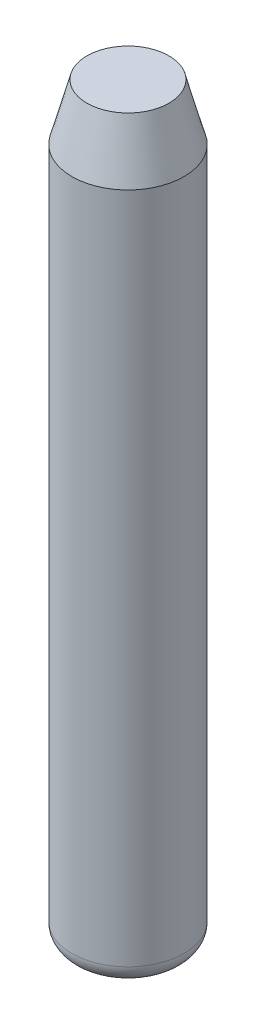
ISO-10303-21;
HEADER;
FILE_DESCRIPTION(('STEP AP214'),'2;1');
FILE_NAME('part.step','',(''),(''),'','','');
FILE_SCHEMA(('AUTOMOTIVE_DESIGN { 1 0 10303 214 1 1 1 1 }'));
ENDSEC;
DATA;
#1=APPLICATION_CONTEXT('core data for automotive mechanical design processes');
#2=APPLICATION_PROTOCOL_DEFINITION('international standard','automotive_design',2000,#1);
#3=PRODUCT_CONTEXT('',#1,'mechanical');
#4=PRODUCT('Part','Part','',(#3));
#5=PRODUCT_RELATED_PRODUCT_CATEGORY('part','',(#4));
#6=PRODUCT_DEFINITION_FORMATION('','',#4);
#7=PRODUCT_DEFINITION_CONTEXT('part definition',#1,'design');
#8=PRODUCT_DEFINITION('design','',#6,#7);
#9=PRODUCT_DEFINITION_SHAPE('','',#8);
#10=(LENGTH_UNIT() NAMED_UNIT(*) SI_UNIT(.MILLI.,.METRE.));
#11=(NAMED_UNIT(*) PLANE_ANGLE_UNIT() SI_UNIT($,.RADIAN.));
#12=(NAMED_UNIT(*) SI_UNIT($,.STERADIAN.) SOLID_ANGLE_UNIT());
#13=UNCERTAINTY_MEASURE_WITH_UNIT(LENGTH_MEASURE(1.E-05),#10,'distance_accuracy_value','');
#14=(GEOMETRIC_REPRESENTATION_CONTEXT(3) GLOBAL_UNCERTAINTY_ASSIGNED_CONTEXT((#13)) GLOBAL_UNIT_ASSIGNED_CONTEXT((#10,
#11,#12)) REPRESENTATION_CONTEXT('',''));
#15=CARTESIAN_POINT('',(0.,0.,0.));
#16=DIRECTION('',(0.,0.,1.));
#17=DIRECTION('',(1.,0.,0.));
#18=AXIS2_PLACEMENT_3D('',#15,#16,#17);
#19=CARTESIAN_POINT('',(0.,20.,0.));
#20=DIRECTION('',(0.,-1.,0.));
#21=DIRECTION('',(0.,0.,-1.));
#22=AXIS2_PLACEMENT_3D('',#19,#20,#21);
#23=CYLINDRICAL_SURFACE('',#22,1.5);
#24=CARTESIAN_POINT('',(0.,0.5,0.));
#25=DIRECTION('',(0.,1.,0.));
#26=DIRECTION('',(0.,0.,1.));
#27=AXIS2_PLACEMENT_3D('',#24,#25,#26);
#28=CIRCLE('',#27,1.5);
#29=CARTESIAN_POINT('',(0.,0.5,1.5));
#30=VERTEX_POINT('',#29);
#31=EDGE_CURVE('E38',#30,#30,#28,.T.);
#32=ORIENTED_EDGE('',*,*,#31,.T.);
#33=EDGE_LOOP('',(#32));
#34=FACE_BOUND('',#33,.T.);
#35=CARTESIAN_POINT('',(0.,18.5,0.));
#36=DIRECTION('',(0.,1.,0.));
#37=DIRECTION('',(0.,0.,1.));
#38=AXIS2_PLACEMENT_3D('',#35,#36,#37);
#39=CIRCLE('',#38,1.5);
#40=CARTESIAN_POINT('',(0.,18.5,1.5));
#41=VERTEX_POINT('',#40);
#42=EDGE_CURVE('E42',#41,#41,#39,.F.);
#43=ORIENTED_EDGE('',*,*,#42,.T.);
#44=EDGE_LOOP('',(#43));
#45=FACE_BOUND('',#44,.T.);
#46=ADVANCED_FACE('F31',(#34,#45),#23,.T.);
#47=CARTESIAN_POINT('',(0.,20.,0.));
#48=DIRECTION('',(0.,1.,0.));
#49=DIRECTION('',(0.,0.,1.));
#50=AXIS2_PLACEMENT_3D('',#47,#48,#49);
#51=PLANE('',#50);
#52=CARTESIAN_POINT('',(0.,20.,0.));
#53=DIRECTION('',(0.,1.,0.));
#54=DIRECTION('',(0.,0.,1.));
#55=AXIS2_PLACEMENT_3D('',#52,#53,#54);
#56=CIRCLE('',#55,1.09807621135331);
#57=CARTESIAN_POINT('',(0.,20.,1.09807621135331));
#58=VERTEX_POINT('',#57);
#59=EDGE_CURVE('E46',#58,#58,#56,.T.);
#60=ORIENTED_EDGE('',*,*,#59,.T.);
#61=EDGE_LOOP('',(#60));
#62=FACE_BOUND('',#61,.T.);
#63=ADVANCED_FACE('F52',(#62),#51,.T.);
#64=CARTESIAN_POINT('',(0.,0.,0.));
#65=DIRECTION('',(0.,1.,0.));
#66=DIRECTION('',(0.,0.,1.));
#67=AXIS2_PLACEMENT_3D('',#64,#65,#66);
#68=PLANE('',#67);
#69=CARTESIAN_POINT('',(0.,0.,0.));
#70=DIRECTION('',(0.,1.,0.));
#71=DIRECTION('',(0.,0.,1.));
#72=AXIS2_PLACEMENT_3D('',#69,#70,#71);
#73=CIRCLE('',#72,1.);
#74=CARTESIAN_POINT('',(0.,0.,1.));
#75=VERTEX_POINT('',#74);
#76=EDGE_CURVE('E10',#75,#75,#73,.F.);
#77=ORIENTED_EDGE('',*,*,#76,.T.);
#78=EDGE_LOOP('',(#77));
#79=FACE_BOUND('',#78,.T.);
#80=ADVANCED_FACE('F56',(#79),#68,.F.);
#81=CARTESIAN_POINT('',(0.,20.,0.));
#82=DIRECTION('',(0.,-1.,0.));
#83=DIRECTION('',(0.,0.,-1.));
#84=AXIS2_PLACEMENT_3D('',#81,#82,#83);
#85=CONICAL_SURFACE('',#84,1.09807621135331,0.261799387799147);
#86=ORIENTED_EDGE('',*,*,#42,.F.);
#87=EDGE_LOOP('',(#86));
#88=FACE_BOUND('',#87,.T.);
#89=ORIENTED_EDGE('',*,*,#59,.F.);
#90=EDGE_LOOP('',(#89));
#91=FACE_BOUND('',#90,.T.);
#92=ADVANCED_FACE('F54',(#88,#91),#85,.T.);
#93=CARTESIAN_POINT('',(0.,0.5,0.));
#94=DIRECTION('',(0.,1.,0.));
#95=DIRECTION('',(0.,0.,1.));
#96=AXIS2_PLACEMENT_3D('',#93,#94,#95);
#97=TOROIDAL_SURFACE('',#96,1.,0.5);
#98=ORIENTED_EDGE('',*,*,#76,.F.);
#99=EDGE_LOOP('',(#98));
#100=FACE_BOUND('',#99,.T.);
#101=ORIENTED_EDGE('',*,*,#31,.F.);
#102=EDGE_LOOP('',(#101));
#103=FACE_BOUND('',#102,.T.);
#104=ADVANCED_FACE('F33',(#100,#103),#97,.T.);
#105=CLOSED_SHELL('',(#46,#63,#80,#92,#104));
#106=MANIFOLD_SOLID_BREP('B2',#105);
#107=ADVANCED_BREP_SHAPE_REPRESENTATION('',(#18,#106),#14);
#108=SHAPE_DEFINITION_REPRESENTATION(#9,#107);
ENDSEC;
END-ISO-10303-21;
